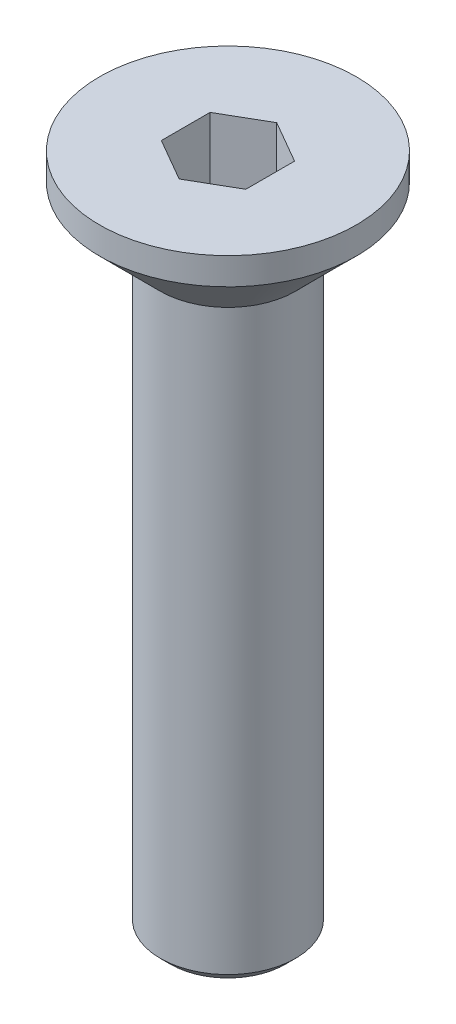
ISO-10303-21;
HEADER;
FILE_DESCRIPTION(('STEP AP214'),'2;1');
FILE_NAME('part.step','',(''),(''),'','','');
FILE_SCHEMA(('AUTOMOTIVE_DESIGN { 1 0 10303 214 1 1 1 1 }'));
ENDSEC;
DATA;
#1=APPLICATION_CONTEXT('core data for automotive mechanical design processes');
#2=APPLICATION_PROTOCOL_DEFINITION('international standard','automotive_design',2000,#1);
#3=PRODUCT_CONTEXT('',#1,'mechanical');
#4=PRODUCT('Part','Part','',(#3));
#5=PRODUCT_RELATED_PRODUCT_CATEGORY('part','',(#4));
#6=PRODUCT_DEFINITION_FORMATION('','',#4);
#7=PRODUCT_DEFINITION_CONTEXT('part definition',#1,'design');
#8=PRODUCT_DEFINITION('design','',#6,#7);
#9=PRODUCT_DEFINITION_SHAPE('','',#8);
#10=(LENGTH_UNIT() NAMED_UNIT(*) SI_UNIT(.MILLI.,.METRE.));
#11=(NAMED_UNIT(*) PLANE_ANGLE_UNIT() SI_UNIT($,.RADIAN.));
#12=(NAMED_UNIT(*) SI_UNIT($,.STERADIAN.) SOLID_ANGLE_UNIT());
#13=UNCERTAINTY_MEASURE_WITH_UNIT(LENGTH_MEASURE(1.E-05),#10,'distance_accuracy_value','');
#14=(GEOMETRIC_REPRESENTATION_CONTEXT(3) GLOBAL_UNCERTAINTY_ASSIGNED_CONTEXT((#13)) GLOBAL_UNIT_ASSIGNED_CONTEXT((#10,
#11,#12)) REPRESENTATION_CONTEXT('',''));
#15=CARTESIAN_POINT('',(0.,0.,0.));
#16=DIRECTION('',(0.,0.,1.));
#17=DIRECTION('',(1.,0.,0.));
#18=AXIS2_PLACEMENT_3D('',#15,#16,#17);
#19=CARTESIAN_POINT('',(0.,0.,0.));
#20=DIRECTION('',(0.,-1.,0.));
#21=DIRECTION('',(0.,0.,-1.));
#22=AXIS2_PLACEMENT_3D('',#19,#20,#21);
#23=PLANE('',#22);
#24=DIRECTION('',(-0.866025403784439,0.,0.5));
#25=VECTOR('',#24,1.);
#26=CARTESIAN_POINT('',(0.,0.,-1.44337567297406));
#27=LINE('',#26,#25);
#28=CARTESIAN_POINT('',(0.,0.,-1.44337567297406));
#29=VERTEX_POINT('',#28);
#30=CARTESIAN_POINT('',(-1.25,0.,-0.721687836487033));
#31=VERTEX_POINT('',#30);
#32=EDGE_CURVE('E106',#29,#31,#27,.T.);
#33=ORIENTED_EDGE('',*,*,#32,.F.);
#34=DIRECTION('',(-0.866025403784439,0.,-0.5));
#35=VECTOR('',#34,1.);
#36=CARTESIAN_POINT('',(1.25,0.,-0.721687836487033));
#37=LINE('',#36,#35);
#38=CARTESIAN_POINT('',(1.25,0.,-0.721687836487033));
#39=VERTEX_POINT('',#38);
#40=EDGE_CURVE('E32',#39,#29,#37,.T.);
#41=ORIENTED_EDGE('',*,*,#40,.F.);
#42=DIRECTION('',(0.,0.,-1.));
#43=VECTOR('',#42,1.);
#44=CARTESIAN_POINT('',(1.25,0.,0.721687836487032));
#45=LINE('',#44,#43);
#46=CARTESIAN_POINT('',(1.25,0.,0.721687836487032));
#47=VERTEX_POINT('',#46);
#48=EDGE_CURVE('E113',#47,#39,#45,.T.);
#49=ORIENTED_EDGE('',*,*,#48,.F.);
#50=DIRECTION('',(0.866025403784439,0.,-0.5));
#51=VECTOR('',#50,1.);
#52=CARTESIAN_POINT('',(0.,0.,1.44337567297406));
#53=LINE('',#52,#51);
#54=CARTESIAN_POINT('',(0.,0.,1.44337567297406));
#55=VERTEX_POINT('',#54);
#56=EDGE_CURVE('E114',#55,#47,#53,.T.);
#57=ORIENTED_EDGE('',*,*,#56,.F.);
#58=DIRECTION('',(0.866025403784439,0.,0.5));
#59=VECTOR('',#58,1.);
#60=CARTESIAN_POINT('',(-1.25,0.,0.721687836487032));
#61=LINE('',#60,#59);
#62=CARTESIAN_POINT('',(-1.25,0.,0.721687836487032));
#63=VERTEX_POINT('',#62);
#64=EDGE_CURVE('E79',#63,#55,#61,.T.);
#65=ORIENTED_EDGE('',*,*,#64,.F.);
#66=DIRECTION('',(0.,0.,1.));
#67=VECTOR('',#66,1.);
#68=CARTESIAN_POINT('',(-1.25,0.,-0.721687836487033));
#69=LINE('',#68,#67);
#70=EDGE_CURVE('E108',#31,#63,#69,.T.);
#71=ORIENTED_EDGE('',*,*,#70,.F.);
#72=EDGE_LOOP('',(#33,#41,#49,#57,#65,#71));
#73=FACE_BOUND('',#72,.T.);
#74=CARTESIAN_POINT('',(0.,0.,0.));
#75=DIRECTION('',(0.,-1.,0.));
#76=DIRECTION('',(0.,0.,-1.));
#77=AXIS2_PLACEMENT_3D('',#74,#75,#76);
#78=CIRCLE('',#77,3.8);
#79=CARTESIAN_POINT('',(0.,0.,-3.8));
#80=VERTEX_POINT('',#79);
#81=EDGE_CURVE('E129',#80,#80,#78,.T.);
#82=ORIENTED_EDGE('',*,*,#81,.F.);
#83=EDGE_LOOP('',(#82));
#84=FACE_BOUND('',#83,.T.);
#85=ADVANCED_FACE('F17',(#73,#84),#23,.F.);
#86=CARTESIAN_POINT('',(0.,0.,0.));
#87=DIRECTION('',(0.,-1.,0.));
#88=DIRECTION('',(0.,0.,-1.));
#89=AXIS2_PLACEMENT_3D('',#86,#87,#88);
#90=CYLINDRICAL_SURFACE('',#89,3.8);
#91=CARTESIAN_POINT('',(0.,-0.799999999999982,0.));
#92=DIRECTION('',(0.,-1.,0.));
#93=DIRECTION('',(0.,0.,-1.));
#94=AXIS2_PLACEMENT_3D('',#91,#92,#93);
#95=CIRCLE('',#94,3.8);
#96=CARTESIAN_POINT('',(0.,-0.799999999999982,-3.8));
#97=VERTEX_POINT('',#96);
#98=EDGE_CURVE('E126',#97,#97,#95,.T.);
#99=ORIENTED_EDGE('',*,*,#98,.F.);
#100=EDGE_LOOP('',(#99));
#101=FACE_BOUND('',#100,.T.);
#102=ORIENTED_EDGE('',*,*,#81,.T.);
#103=EDGE_LOOP('',(#102));
#104=FACE_BOUND('',#103,.T.);
#105=ADVANCED_FACE('F152',(#101,#104),#90,.T.);
#106=CARTESIAN_POINT('',(0.,-0.799999999999982,0.));
#107=DIRECTION('',(0.,1.,0.));
#108=DIRECTION('',(0.,0.,1.));
#109=AXIS2_PLACEMENT_3D('',#106,#107,#108);
#110=CONICAL_SURFACE('',#109,3.8,0.785398163397443);
#111=CARTESIAN_POINT('',(0.,-2.6,0.));
#112=DIRECTION('',(0.,-1.,0.));
#113=DIRECTION('',(0.,0.,-1.));
#114=AXIS2_PLACEMENT_3D('',#111,#112,#113);
#115=CIRCLE('',#114,2.);
#116=CARTESIAN_POINT('',(0.,-2.6,-2.));
#117=VERTEX_POINT('',#116);
#118=EDGE_CURVE('E118',#117,#117,#115,.T.);
#119=ORIENTED_EDGE('',*,*,#118,.F.);
#120=EDGE_LOOP('',(#119));
#121=FACE_BOUND('',#120,.T.);
#122=ORIENTED_EDGE('',*,*,#98,.T.);
#123=EDGE_LOOP('',(#122));
#124=FACE_BOUND('',#123,.T.);
#125=ADVANCED_FACE('F159',(#121,#124),#110,.T.);
#126=CARTESIAN_POINT('',(0.,-20.,0.));
#127=DIRECTION('',(0.,1.,0.));
#128=DIRECTION('',(0.,0.,1.));
#129=AXIS2_PLACEMENT_3D('',#126,#127,#128);
#130=CYLINDRICAL_SURFACE('',#129,2.);
#131=CARTESIAN_POINT('',(0.,-19.7,0.));
#132=DIRECTION('',(0.,1.,0.));
#133=DIRECTION('',(0.,0.,1.));
#134=AXIS2_PLACEMENT_3D('',#131,#132,#133);
#135=CIRCLE('',#134,2.);
#136=CARTESIAN_POINT('',(0.,-19.7,2.));
#137=VERTEX_POINT('',#136);
#138=EDGE_CURVE('E25',#137,#137,#135,.T.);
#139=ORIENTED_EDGE('',*,*,#138,.T.);
#140=EDGE_LOOP('',(#139));
#141=FACE_BOUND('',#140,.T.);
#142=ORIENTED_EDGE('',*,*,#118,.T.);
#143=EDGE_LOOP('',(#142));
#144=FACE_BOUND('',#143,.T.);
#145=ADVANCED_FACE('F134',(#141,#144),#130,.T.);
#146=CARTESIAN_POINT('',(0.,-20.,0.));
#147=DIRECTION('',(0.,1.,0.));
#148=DIRECTION('',(0.,0.,1.));
#149=AXIS2_PLACEMENT_3D('',#146,#147,#148);
#150=PLANE('',#149);
#151=CARTESIAN_POINT('',(0.,-20.,0.));
#152=DIRECTION('',(0.,1.,0.));
#153=DIRECTION('',(0.,0.,1.));
#154=AXIS2_PLACEMENT_3D('',#151,#152,#153);
#155=CIRCLE('',#154,1.7);
#156=CARTESIAN_POINT('',(0.,-20.,1.7));
#157=VERTEX_POINT('',#156);
#158=EDGE_CURVE('E11',#157,#157,#155,.F.);
#159=ORIENTED_EDGE('',*,*,#158,.T.);
#160=EDGE_LOOP('',(#159));
#161=FACE_BOUND('',#160,.T.);
#162=ADVANCED_FACE('F138',(#161),#150,.F.);
#163=CARTESIAN_POINT('',(0.,-19.7,0.));
#164=DIRECTION('',(0.,1.,0.));
#165=DIRECTION('',(0.,0.,1.));
#166=AXIS2_PLACEMENT_3D('',#163,#164,#165);
#167=CONICAL_SURFACE('',#166,2.,0.785398163397451);
#168=ORIENTED_EDGE('',*,*,#158,.F.);
#169=EDGE_LOOP('',(#168));
#170=FACE_BOUND('',#169,.T.);
#171=ORIENTED_EDGE('',*,*,#138,.F.);
#172=EDGE_LOOP('',(#171));
#173=FACE_BOUND('',#172,.T.);
#174=ADVANCED_FACE('F19',(#170,#173),#167,.T.);
#175=CARTESIAN_POINT('',(1.25,-3.,-0.721687836487033));
#176=DIRECTION('',(0.5,0.,-0.866025403784439));
#177=DIRECTION('',(-0.866025403784439,0.,-0.5));
#178=AXIS2_PLACEMENT_3D('',#175,#176,#177);
#179=PLANE('',#178);
#180=ORIENTED_EDGE('',*,*,#40,.T.);
#181=DIRECTION('',(0.,1.,0.));
#182=VECTOR('',#181,1.);
#183=CARTESIAN_POINT('',(0.,-3.,-1.44337567297406));
#184=LINE('',#183,#182);
#185=CARTESIAN_POINT('',(0.,-3.,-1.44337567297406));
#186=VERTEX_POINT('',#185);
#187=EDGE_CURVE('E62',#186,#29,#184,.T.);
#188=ORIENTED_EDGE('',*,*,#187,.F.);
#189=DIRECTION('',(-0.866025403784439,0.,-0.5));
#190=VECTOR('',#189,1.);
#191=CARTESIAN_POINT('',(1.25,-3.,-0.721687836487033));
#192=LINE('',#191,#190);
#193=CARTESIAN_POINT('',(1.25,-3.,-0.721687836487033));
#194=VERTEX_POINT('',#193);
#195=EDGE_CURVE('E117',#194,#186,#192,.T.);
#196=ORIENTED_EDGE('',*,*,#195,.F.);
#197=DIRECTION('',(0.,1.,0.));
#198=VECTOR('',#197,1.);
#199=CARTESIAN_POINT('',(1.25,-3.,-0.721687836487033));
#200=LINE('',#199,#198);
#201=EDGE_CURVE('E37',#194,#39,#200,.T.);
#202=ORIENTED_EDGE('',*,*,#201,.T.);
#203=EDGE_LOOP('',(#180,#188,#196,#202));
#204=FACE_BOUND('',#203,.T.);
#205=ADVANCED_FACE('F136',(#204),#179,.F.);
#206=CARTESIAN_POINT('',(1.25,-3.,0.721687836487032));
#207=DIRECTION('',(1.,0.,0.));
#208=DIRECTION('',(0.,0.,-1.));
#209=AXIS2_PLACEMENT_3D('',#206,#207,#208);
#210=PLANE('',#209);
#211=ORIENTED_EDGE('',*,*,#48,.T.);
#212=ORIENTED_EDGE('',*,*,#201,.F.);
#213=DIRECTION('',(0.,0.,-1.));
#214=VECTOR('',#213,1.);
#215=CARTESIAN_POINT('',(1.25,-3.,0.721687836487032));
#216=LINE('',#215,#214);
#217=CARTESIAN_POINT('',(1.25,-3.,0.721687836487032));
#218=VERTEX_POINT('',#217);
#219=EDGE_CURVE('E95',#218,#194,#216,.T.);
#220=ORIENTED_EDGE('',*,*,#219,.F.);
#221=DIRECTION('',(0.,1.,0.));
#222=VECTOR('',#221,1.);
#223=CARTESIAN_POINT('',(1.25,-3.,0.721687836487032));
#224=LINE('',#223,#222);
#225=EDGE_CURVE('E81',#218,#47,#224,.T.);
#226=ORIENTED_EDGE('',*,*,#225,.T.);
#227=EDGE_LOOP('',(#211,#212,#220,#226));
#228=FACE_BOUND('',#227,.T.);
#229=ADVANCED_FACE('F146',(#228),#210,.F.);
#230=CARTESIAN_POINT('',(0.,-3.,1.44337567297406));
#231=DIRECTION('',(0.5,0.,0.866025403784438));
#232=DIRECTION('',(0.866025403784439,0.,-0.5));
#233=AXIS2_PLACEMENT_3D('',#230,#231,#232);
#234=PLANE('',#233);
#235=ORIENTED_EDGE('',*,*,#56,.T.);
#236=ORIENTED_EDGE('',*,*,#225,.F.);
#237=DIRECTION('',(0.866025403784439,0.,-0.5));
#238=VECTOR('',#237,1.);
#239=CARTESIAN_POINT('',(0.,-3.,1.44337567297406));
#240=LINE('',#239,#238);
#241=CARTESIAN_POINT('',(0.,-3.,1.44337567297406));
#242=VERTEX_POINT('',#241);
#243=EDGE_CURVE('E86',#242,#218,#240,.T.);
#244=ORIENTED_EDGE('',*,*,#243,.F.);
#245=DIRECTION('',(0.,1.,0.));
#246=VECTOR('',#245,1.);
#247=CARTESIAN_POINT('',(0.,-3.,1.44337567297406));
#248=LINE('',#247,#246);
#249=EDGE_CURVE('E73',#242,#55,#248,.T.);
#250=ORIENTED_EDGE('',*,*,#249,.T.);
#251=EDGE_LOOP('',(#235,#236,#244,#250));
#252=FACE_BOUND('',#251,.T.);
#253=ADVANCED_FACE('F90',(#252),#234,.F.);
#254=CARTESIAN_POINT('',(-1.25,-3.,0.721687836487032));
#255=DIRECTION('',(-0.5,0.,0.866025403784439));
#256=DIRECTION('',(0.866025403784439,0.,0.5));
#257=AXIS2_PLACEMENT_3D('',#254,#255,#256);
#258=PLANE('',#257);
#259=ORIENTED_EDGE('',*,*,#64,.T.);
#260=ORIENTED_EDGE('',*,*,#249,.F.);
#261=DIRECTION('',(0.866025403784439,0.,0.5));
#262=VECTOR('',#261,1.);
#263=CARTESIAN_POINT('',(-1.25,-3.,0.721687836487032));
#264=LINE('',#263,#262);
#265=CARTESIAN_POINT('',(-1.25,-3.,0.721687836487032));
#266=VERTEX_POINT('',#265);
#267=EDGE_CURVE('E80',#266,#242,#264,.T.);
#268=ORIENTED_EDGE('',*,*,#267,.F.);
#269=DIRECTION('',(0.,1.,0.));
#270=VECTOR('',#269,1.);
#271=CARTESIAN_POINT('',(-1.25,-3.,0.721687836487032));
#272=LINE('',#271,#270);
#273=EDGE_CURVE('E83',#266,#63,#272,.T.);
#274=ORIENTED_EDGE('',*,*,#273,.T.);
#275=EDGE_LOOP('',(#259,#260,#268,#274));
#276=FACE_BOUND('',#275,.T.);
#277=ADVANCED_FACE('F74',(#276),#258,.F.);
#278=CARTESIAN_POINT('',(-1.25,-3.,-0.721687836487033));
#279=DIRECTION('',(-1.,0.,0.));
#280=DIRECTION('',(0.,0.,1.));
#281=AXIS2_PLACEMENT_3D('',#278,#279,#280);
#282=PLANE('',#281);
#283=ORIENTED_EDGE('',*,*,#70,.T.);
#284=ORIENTED_EDGE('',*,*,#273,.F.);
#285=DIRECTION('',(0.,0.,1.));
#286=VECTOR('',#285,1.);
#287=CARTESIAN_POINT('',(-1.25,-3.,-0.721687836487033));
#288=LINE('',#287,#286);
#289=CARTESIAN_POINT('',(-1.25,-3.,-0.721687836487033));
#290=VERTEX_POINT('',#289);
#291=EDGE_CURVE('E98',#290,#266,#288,.T.);
#292=ORIENTED_EDGE('',*,*,#291,.F.);
#293=DIRECTION('',(0.,1.,0.));
#294=VECTOR('',#293,1.);
#295=CARTESIAN_POINT('',(-1.25,-3.,-0.721687836487033));
#296=LINE('',#295,#294);
#297=EDGE_CURVE('E121',#290,#31,#296,.T.);
#298=ORIENTED_EDGE('',*,*,#297,.T.);
#299=EDGE_LOOP('',(#283,#284,#292,#298));
#300=FACE_BOUND('',#299,.T.);
#301=ADVANCED_FACE('F173',(#300),#282,.F.);
#302=CARTESIAN_POINT('',(0.,-3.,-1.44337567297406));
#303=DIRECTION('',(-0.5,0.,-0.866025403784439));
#304=DIRECTION('',(-0.866025403784439,0.,0.5));
#305=AXIS2_PLACEMENT_3D('',#302,#303,#304);
#306=PLANE('',#305);
#307=ORIENTED_EDGE('',*,*,#32,.T.);
#308=ORIENTED_EDGE('',*,*,#297,.F.);
#309=DIRECTION('',(-0.866025403784439,0.,0.5));
#310=VECTOR('',#309,1.);
#311=CARTESIAN_POINT('',(0.,-3.,-1.44337567297406));
#312=LINE('',#311,#310);
#313=EDGE_CURVE('E99',#186,#290,#312,.T.);
#314=ORIENTED_EDGE('',*,*,#313,.F.);
#315=ORIENTED_EDGE('',*,*,#187,.T.);
#316=EDGE_LOOP('',(#307,#308,#314,#315));
#317=FACE_BOUND('',#316,.T.);
#318=ADVANCED_FACE('F171',(#317),#306,.F.);
#319=CARTESIAN_POINT('',(0.,-3.,0.));
#320=DIRECTION('',(0.,1.,0.));
#321=DIRECTION('',(0.,0.,1.));
#322=AXIS2_PLACEMENT_3D('',#319,#320,#321);
#323=PLANE('',#322);
#324=ORIENTED_EDGE('',*,*,#195,.T.);
#325=ORIENTED_EDGE('',*,*,#313,.T.);
#326=ORIENTED_EDGE('',*,*,#291,.T.);
#327=ORIENTED_EDGE('',*,*,#267,.T.);
#328=ORIENTED_EDGE('',*,*,#243,.T.);
#329=ORIENTED_EDGE('',*,*,#219,.T.);
#330=EDGE_LOOP('',(#324,#325,#326,#327,#328,#329));
#331=FACE_BOUND('',#330,.T.);
#332=ADVANCED_FACE('F92',(#331),#323,.T.);
#333=CLOSED_SHELL('',(#85,#105,#125,#145,#162,#174,#205,#229,#253,#277,#301,#318,#332));
#334=MANIFOLD_SOLID_BREP('B1',#333);
#335=ADVANCED_BREP_SHAPE_REPRESENTATION('',(#18,#334),#14);
#336=SHAPE_DEFINITION_REPRESENTATION(#9,#335);
ENDSEC;
END-ISO-10303-21;
